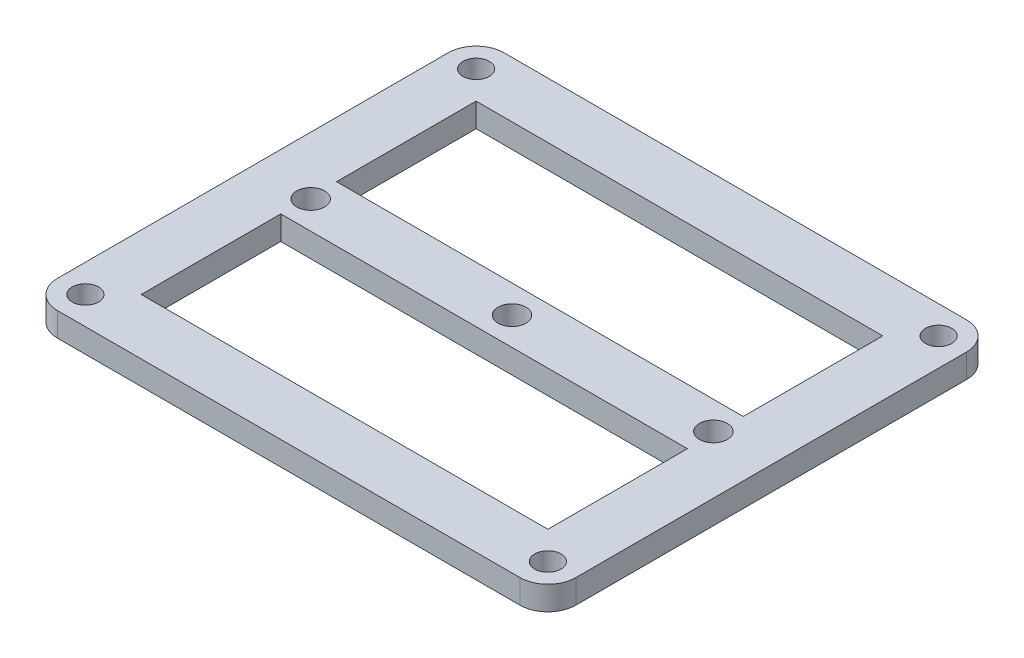
ISO-10303-21;
HEADER;
FILE_DESCRIPTION(('STEP AP214'),'2;1');
FILE_NAME('part.step','',(''),(''),'','','');
FILE_SCHEMA(('AUTOMOTIVE_DESIGN { 1 0 10303 214 1 1 1 1 }'));
ENDSEC;
DATA;
#1=APPLICATION_CONTEXT('core data for automotive mechanical design processes');
#2=APPLICATION_PROTOCOL_DEFINITION('international standard','automotive_design',2000,#1);
#3=PRODUCT_CONTEXT('',#1,'mechanical');
#4=PRODUCT('Part','Part','',(#3));
#5=PRODUCT_RELATED_PRODUCT_CATEGORY('part','',(#4));
#6=PRODUCT_DEFINITION_FORMATION('','',#4);
#7=PRODUCT_DEFINITION_CONTEXT('part definition',#1,'design');
#8=PRODUCT_DEFINITION('design','',#6,#7);
#9=PRODUCT_DEFINITION_SHAPE('','',#8);
#10=(LENGTH_UNIT() NAMED_UNIT(*) SI_UNIT(.MILLI.,.METRE.));
#11=(NAMED_UNIT(*) PLANE_ANGLE_UNIT() SI_UNIT($,.RADIAN.));
#12=(NAMED_UNIT(*) SI_UNIT($,.STERADIAN.) SOLID_ANGLE_UNIT());
#13=UNCERTAINTY_MEASURE_WITH_UNIT(LENGTH_MEASURE(1.E-05),#10,'distance_accuracy_value','');
#14=(GEOMETRIC_REPRESENTATION_CONTEXT(3) GLOBAL_UNCERTAINTY_ASSIGNED_CONTEXT((#13)) GLOBAL_UNIT_ASSIGNED_CONTEXT((#10,
#11,#12)) REPRESENTATION_CONTEXT('',''));
#15=CARTESIAN_POINT('',(0.,0.,0.));
#16=DIRECTION('',(0.,0.,1.));
#17=DIRECTION('',(1.,0.,0.));
#18=AXIS2_PLACEMENT_3D('',#15,#16,#17);
#19=CARTESIAN_POINT('',(3.50000000000018,3.,0.));
#20=DIRECTION('',(-1.,0.,0.));
#21=DIRECTION('',(0.,0.,1.));
#22=AXIS2_PLACEMENT_3D('',#19,#20,#21);
#23=PLANE('',#22);
#24=DIRECTION('',(0.,0.,-1.));
#25=VECTOR('',#24,1.);
#26=CARTESIAN_POINT('',(3.50000000000018,0.,0.));
#27=LINE('',#26,#25);
#28=CARTESIAN_POINT('',(3.50000000000018,0.,-3.50000000000023));
#29=VERTEX_POINT('',#28);
#30=CARTESIAN_POINT('',(3.50000000000017,0.,-21.));
#31=VERTEX_POINT('',#30);
#32=EDGE_CURVE('E233',#29,#31,#27,.T.);
#33=ORIENTED_EDGE('',*,*,#32,.T.);
#34=DIRECTION('',(0.,-1.,0.));
#35=VECTOR('',#34,1.);
#36=CARTESIAN_POINT('',(3.50000000000017,3.,-21.));
#37=LINE('',#36,#35);
#38=CARTESIAN_POINT('',(3.50000000000017,3.,-21.));
#39=VERTEX_POINT('',#38);
#40=EDGE_CURVE('E251',#39,#31,#37,.T.);
#41=ORIENTED_EDGE('',*,*,#40,.F.);
#42=DIRECTION('',(0.,0.,-1.));
#43=VECTOR('',#42,1.);
#44=CARTESIAN_POINT('',(3.50000000000018,3.,0.));
#45=LINE('',#44,#43);
#46=CARTESIAN_POINT('',(3.50000000000018,3.,-3.50000000000023));
#47=VERTEX_POINT('',#46);
#48=EDGE_CURVE('E187',#47,#39,#45,.T.);
#49=ORIENTED_EDGE('',*,*,#48,.F.);
#50=DIRECTION('',(0.,-1.,0.));
#51=VECTOR('',#50,1.);
#52=CARTESIAN_POINT('',(3.50000000000018,3.,-3.50000000000023));
#53=LINE('',#52,#51);
#54=EDGE_CURVE('E157',#47,#29,#53,.T.);
#55=ORIENTED_EDGE('',*,*,#54,.T.);
#56=EDGE_LOOP('',(#33,#41,#49,#55));
#57=FACE_BOUND('',#56,.T.);
#58=ADVANCED_FACE('F33',(#57),#23,.F.);
#59=CARTESIAN_POINT('',(0.,3.,-21.));
#60=DIRECTION('',(0.,0.,-1.));
#61=DIRECTION('',(-1.,0.,0.));
#62=AXIS2_PLACEMENT_3D('',#59,#60,#61);
#63=PLANE('',#62);
#64=DIRECTION('',(1.,0.,0.));
#65=VECTOR('',#64,1.);
#66=CARTESIAN_POINT('',(0.,0.,-21.));
#67=LINE('',#66,#65);
#68=CARTESIAN_POINT('',(54.4999999999999,0.,-21.));
#69=VERTEX_POINT('',#68);
#70=EDGE_CURVE('E236',#31,#69,#67,.T.);
#71=ORIENTED_EDGE('',*,*,#70,.T.);
#72=DIRECTION('',(0.,-1.,0.));
#73=VECTOR('',#72,1.);
#74=CARTESIAN_POINT('',(54.4999999999999,3.,-21.));
#75=LINE('',#74,#73);
#76=CARTESIAN_POINT('',(54.4999999999999,3.,-21.));
#77=VERTEX_POINT('',#76);
#78=EDGE_CURVE('E249',#77,#69,#75,.T.);
#79=ORIENTED_EDGE('',*,*,#78,.F.);
#80=DIRECTION('',(1.,0.,0.));
#81=VECTOR('',#80,1.);
#82=CARTESIAN_POINT('',(0.,3.,-21.));
#83=LINE('',#82,#81);
#84=EDGE_CURVE('E190',#39,#77,#83,.T.);
#85=ORIENTED_EDGE('',*,*,#84,.F.);
#86=ORIENTED_EDGE('',*,*,#40,.T.);
#87=EDGE_LOOP('',(#71,#79,#85,#86));
#88=FACE_BOUND('',#87,.T.);
#89=ADVANCED_FACE('F330',(#88),#63,.F.);
#90=CARTESIAN_POINT('',(54.4999999999998,3.,0.));
#91=DIRECTION('',(-1.,0.,0.));
#92=DIRECTION('',(0.,0.,1.));
#93=AXIS2_PLACEMENT_3D('',#90,#91,#92);
#94=PLANE('',#93);
#95=DIRECTION('',(0.,0.,-1.));
#96=VECTOR('',#95,1.);
#97=CARTESIAN_POINT('',(54.4999999999998,0.,0.));
#98=LINE('',#97,#96);
#99=CARTESIAN_POINT('',(54.4999999999998,0.,-3.50000000000003));
#100=VERTEX_POINT('',#99);
#101=EDGE_CURVE('E239',#100,#69,#98,.T.);
#102=ORIENTED_EDGE('',*,*,#101,.F.);
#103=DIRECTION('',(0.,-1.,0.));
#104=VECTOR('',#103,1.);
#105=CARTESIAN_POINT('',(54.4999999999998,3.,-3.50000000000003));
#106=LINE('',#105,#104);
#107=CARTESIAN_POINT('',(54.4999999999998,3.,-3.50000000000003));
#108=VERTEX_POINT('',#107);
#109=EDGE_CURVE('E247',#108,#100,#106,.T.);
#110=ORIENTED_EDGE('',*,*,#109,.F.);
#111=DIRECTION('',(0.,0.,-1.));
#112=VECTOR('',#111,1.);
#113=CARTESIAN_POINT('',(54.4999999999998,3.,0.));
#114=LINE('',#113,#112);
#115=EDGE_CURVE('E192',#108,#77,#114,.T.);
#116=ORIENTED_EDGE('',*,*,#115,.T.);
#117=ORIENTED_EDGE('',*,*,#78,.T.);
#118=EDGE_LOOP('',(#102,#110,#116,#117));
#119=FACE_BOUND('',#118,.T.);
#120=ADVANCED_FACE('F336',(#119),#94,.T.);
#121=CARTESIAN_POINT('',(-3.5,3.,0.));
#122=DIRECTION('',(-1.,0.,0.));
#123=DIRECTION('',(0.,0.,1.));
#124=AXIS2_PLACEMENT_3D('',#121,#122,#123);
#125=PLANE('',#124);
#126=DIRECTION('',(0.,0.,-1.));
#127=VECTOR('',#126,1.);
#128=CARTESIAN_POINT('',(-3.5,0.,0.));
#129=LINE('',#128,#127);
#130=CARTESIAN_POINT('',(-3.5,0.,0.));
#131=VERTEX_POINT('',#130);
#132=CARTESIAN_POINT('',(-3.5,0.,-49.));
#133=VERTEX_POINT('',#132);
#134=EDGE_CURVE('E221',#131,#133,#129,.T.);
#135=ORIENTED_EDGE('',*,*,#134,.F.);
#136=DIRECTION('',(0.,-1.,0.));
#137=VECTOR('',#136,1.);
#138=CARTESIAN_POINT('',(-3.5,3.,0.));
#139=LINE('',#138,#137);
#140=CARTESIAN_POINT('',(-3.5,3.,0.));
#141=VERTEX_POINT('',#140);
#142=EDGE_CURVE('E275',#131,#141,#139,.F.);
#143=ORIENTED_EDGE('',*,*,#142,.T.);
#144=DIRECTION('',(0.,0.,-1.));
#145=VECTOR('',#144,1.);
#146=CARTESIAN_POINT('',(-3.5,3.,0.));
#147=LINE('',#146,#145);
#148=CARTESIAN_POINT('',(-3.5,3.,-49.));
#149=VERTEX_POINT('',#148);
#150=EDGE_CURVE('E177',#141,#149,#147,.T.);
#151=ORIENTED_EDGE('',*,*,#150,.T.);
#152=DIRECTION('',(0.,-1.,0.));
#153=VECTOR('',#152,1.);
#154=CARTESIAN_POINT('',(-3.5,3.,-49.));
#155=LINE('',#154,#153);
#156=EDGE_CURVE('E272',#149,#133,#155,.T.);
#157=ORIENTED_EDGE('',*,*,#156,.T.);
#158=EDGE_LOOP('',(#135,#143,#151,#157));
#159=FACE_BOUND('',#158,.T.);
#160=ADVANCED_FACE('F311',(#159),#125,.T.);
#161=CARTESIAN_POINT('',(0.,3.,3.50000000000005));
#162=DIRECTION('',(0.,0.,-1.));
#163=DIRECTION('',(-1.,0.,0.));
#164=AXIS2_PLACEMENT_3D('',#161,#162,#163);
#165=PLANE('',#164);
#166=DIRECTION('',(1.,0.,0.));
#167=VECTOR('',#166,1.);
#168=CARTESIAN_POINT('',(0.,3.,3.50000000000005));
#169=LINE('',#168,#167);
#170=CARTESIAN_POINT('',(0.,3.,3.50000000000005));
#171=VERTEX_POINT('',#170);
#172=CARTESIAN_POINT('',(58.,3.,3.49999999999986));
#173=VERTEX_POINT('',#172);
#174=EDGE_CURVE('E180',#171,#173,#169,.T.);
#175=ORIENTED_EDGE('',*,*,#174,.F.);
#176=DIRECTION('',(0.,-1.,0.));
#177=VECTOR('',#176,1.);
#178=CARTESIAN_POINT('',(0.,0.,3.50000000000005));
#179=LINE('',#178,#177);
#180=CARTESIAN_POINT('',(0.,0.,3.50000000000005));
#181=VERTEX_POINT('',#180);
#182=EDGE_CURVE('E261',#171,#181,#179,.T.);
#183=ORIENTED_EDGE('',*,*,#182,.T.);
#184=DIRECTION('',(1.,0.,0.));
#185=VECTOR('',#184,1.);
#186=CARTESIAN_POINT('',(0.,0.,3.50000000000005));
#187=LINE('',#186,#185);
#188=CARTESIAN_POINT('',(58.,0.,3.49999999999986));
#189=VERTEX_POINT('',#188);
#190=EDGE_CURVE('E224',#181,#189,#187,.T.);
#191=ORIENTED_EDGE('',*,*,#190,.T.);
#192=DIRECTION('',(0.,-1.,0.));
#193=VECTOR('',#192,1.);
#194=CARTESIAN_POINT('',(58.,3.,3.49999999999986));
#195=LINE('',#194,#193);
#196=EDGE_CURVE('E254',#189,#173,#195,.F.);
#197=ORIENTED_EDGE('',*,*,#196,.T.);
#198=EDGE_LOOP('',(#175,#183,#191,#197));
#199=FACE_BOUND('',#198,.T.);
#200=ADVANCED_FACE('F319',(#199),#165,.F.);
#201=CARTESIAN_POINT('',(61.5,3.,1.90509810308168E-13));
#202=DIRECTION('',(-1.,0.,0.));
#203=DIRECTION('',(0.,0.,1.));
#204=AXIS2_PLACEMENT_3D('',#201,#202,#203);
#205=PLANE('',#204);
#206=DIRECTION('',(0.,0.,-1.));
#207=VECTOR('',#206,1.);
#208=CARTESIAN_POINT('',(61.5,3.,1.90509810308168E-13));
#209=LINE('',#208,#207);
#210=CARTESIAN_POINT('',(61.5,3.,1.90509810308168E-13));
#211=VERTEX_POINT('',#210);
#212=CARTESIAN_POINT('',(61.5000000000002,3.,-49.));
#213=VERTEX_POINT('',#212);
#214=EDGE_CURVE('E183',#211,#213,#209,.T.);
#215=ORIENTED_EDGE('',*,*,#214,.F.);
#216=DIRECTION('',(0.,-1.,0.));
#217=VECTOR('',#216,1.);
#218=CARTESIAN_POINT('',(61.5,3.,1.90509810308168E-13));
#219=LINE('',#218,#217);
#220=CARTESIAN_POINT('',(61.5,0.,1.90509810308168E-13));
#221=VERTEX_POINT('',#220);
#222=EDGE_CURVE('E286',#211,#221,#219,.T.);
#223=ORIENTED_EDGE('',*,*,#222,.T.);
#224=DIRECTION('',(0.,0.,-1.));
#225=VECTOR('',#224,1.);
#226=CARTESIAN_POINT('',(61.5,0.,1.90509810308168E-13));
#227=LINE('',#226,#225);
#228=CARTESIAN_POINT('',(61.5000000000002,0.,-49.));
#229=VERTEX_POINT('',#228);
#230=EDGE_CURVE('E227',#221,#229,#227,.T.);
#231=ORIENTED_EDGE('',*,*,#230,.T.);
#232=DIRECTION('',(0.,-1.,0.));
#233=VECTOR('',#232,1.);
#234=CARTESIAN_POINT('',(61.5000000000002,3.,-49.));
#235=LINE('',#234,#233);
#236=EDGE_CURVE('E284',#229,#213,#235,.F.);
#237=ORIENTED_EDGE('',*,*,#236,.T.);
#238=EDGE_LOOP('',(#215,#223,#231,#237));
#239=FACE_BOUND('',#238,.T.);
#240=ADVANCED_FACE('F292',(#239),#205,.F.);
#241=CARTESIAN_POINT('',(54.4999999999999,3.,0.));
#242=DIRECTION('',(-1.,0.,0.));
#243=DIRECTION('',(0.,0.,1.));
#244=AXIS2_PLACEMENT_3D('',#241,#242,#243);
#245=PLANE('',#244);
#246=DIRECTION('',(0.,0.,-1.));
#247=VECTOR('',#246,1.);
#248=CARTESIAN_POINT('',(54.4999999999999,0.,0.));
#249=LINE('',#248,#247);
#250=CARTESIAN_POINT('',(54.4999999999999,0.,-28.));
#251=VERTEX_POINT('',#250);
#252=CARTESIAN_POINT('',(54.4999999999999,0.,-45.5));
#253=VERTEX_POINT('',#252);
#254=EDGE_CURVE('E152',#251,#253,#249,.T.);
#255=ORIENTED_EDGE('',*,*,#254,.F.);
#256=DIRECTION('',(0.,-1.,0.));
#257=VECTOR('',#256,1.);
#258=CARTESIAN_POINT('',(54.4999999999999,3.,-28.));
#259=LINE('',#258,#257);
#260=CARTESIAN_POINT('',(54.4999999999999,3.,-28.));
#261=VERTEX_POINT('',#260);
#262=EDGE_CURVE('E147',#261,#251,#259,.T.);
#263=ORIENTED_EDGE('',*,*,#262,.F.);
#264=DIRECTION('',(0.,0.,-1.));
#265=VECTOR('',#264,1.);
#266=CARTESIAN_POINT('',(54.4999999999999,3.,0.));
#267=LINE('',#266,#265);
#268=CARTESIAN_POINT('',(54.4999999999999,3.,-45.5));
#269=VERTEX_POINT('',#268);
#270=EDGE_CURVE('E150',#261,#269,#267,.T.);
#271=ORIENTED_EDGE('',*,*,#270,.T.);
#272=DIRECTION('',(0.,-1.,0.));
#273=VECTOR('',#272,1.);
#274=CARTESIAN_POINT('',(54.4999999999999,3.,-45.5));
#275=LINE('',#274,#273);
#276=EDGE_CURVE('E198',#269,#253,#275,.T.);
#277=ORIENTED_EDGE('',*,*,#276,.T.);
#278=EDGE_LOOP('',(#255,#263,#271,#277));
#279=FACE_BOUND('',#278,.T.);
#280=ADVANCED_FACE('F149',(#279),#245,.T.);
#281=CARTESIAN_POINT('',(0.,3.,-28.));
#282=DIRECTION('',(0.,0.,-1.));
#283=DIRECTION('',(-1.,0.,0.));
#284=AXIS2_PLACEMENT_3D('',#281,#282,#283);
#285=PLANE('',#284);
#286=DIRECTION('',(1.,0.,0.));
#287=VECTOR('',#286,1.);
#288=CARTESIAN_POINT('',(0.,0.,-28.));
#289=LINE('',#288,#287);
#290=CARTESIAN_POINT('',(3.50000000000017,0.,-28.));
#291=VERTEX_POINT('',#290);
#292=EDGE_CURVE('E213',#291,#251,#289,.T.);
#293=ORIENTED_EDGE('',*,*,#292,.F.);
#294=DIRECTION('',(0.,-1.,0.));
#295=VECTOR('',#294,1.);
#296=CARTESIAN_POINT('',(3.50000000000017,3.,-28.));
#297=LINE('',#296,#295);
#298=CARTESIAN_POINT('',(3.50000000000017,3.,-28.));
#299=VERTEX_POINT('',#298);
#300=EDGE_CURVE('E158',#299,#291,#297,.T.);
#301=ORIENTED_EDGE('',*,*,#300,.F.);
#302=DIRECTION('',(1.,0.,0.));
#303=VECTOR('',#302,1.);
#304=CARTESIAN_POINT('',(0.,3.,-28.));
#305=LINE('',#304,#303);
#306=EDGE_CURVE('E164',#299,#261,#305,.T.);
#307=ORIENTED_EDGE('',*,*,#306,.T.);
#308=ORIENTED_EDGE('',*,*,#262,.T.);
#309=EDGE_LOOP('',(#293,#301,#307,#308));
#310=FACE_BOUND('',#309,.T.);
#311=ADVANCED_FACE('F169',(#310),#285,.T.);
#312=CARTESIAN_POINT('',(3.50000000000018,3.,0.));
#313=DIRECTION('',(-1.,0.,0.));
#314=DIRECTION('',(0.,0.,1.));
#315=AXIS2_PLACEMENT_3D('',#312,#313,#314);
#316=PLANE('',#315);
#317=DIRECTION('',(0.,0.,-1.));
#318=VECTOR('',#317,1.);
#319=CARTESIAN_POINT('',(3.50000000000018,0.,0.));
#320=LINE('',#319,#318);
#321=CARTESIAN_POINT('',(3.50000000000017,0.,-45.4999999999998));
#322=VERTEX_POINT('',#321);
#323=EDGE_CURVE('E215',#291,#322,#320,.T.);
#324=ORIENTED_EDGE('',*,*,#323,.T.);
#325=DIRECTION('',(0.,-1.,0.));
#326=VECTOR('',#325,1.);
#327=CARTESIAN_POINT('',(3.50000000000017,3.,-45.4999999999998));
#328=LINE('',#327,#326);
#329=CARTESIAN_POINT('',(3.50000000000017,3.,-45.4999999999998));
#330=VERTEX_POINT('',#329);
#331=EDGE_CURVE('E256',#330,#322,#328,.T.);
#332=ORIENTED_EDGE('',*,*,#331,.F.);
#333=DIRECTION('',(0.,0.,-1.));
#334=VECTOR('',#333,1.);
#335=CARTESIAN_POINT('',(3.50000000000018,3.,0.));
#336=LINE('',#335,#334);
#337=EDGE_CURVE('E171',#299,#330,#336,.T.);
#338=ORIENTED_EDGE('',*,*,#337,.F.);
#339=ORIENTED_EDGE('',*,*,#300,.T.);
#340=EDGE_LOOP('',(#324,#332,#338,#339));
#341=FACE_BOUND('',#340,.T.);
#342=ADVANCED_FACE('F344',(#341),#316,.F.);
#343=CARTESIAN_POINT('',(0.,3.,-52.5));
#344=DIRECTION('',(0.,0.,-1.));
#345=DIRECTION('',(-1.,0.,0.));
#346=AXIS2_PLACEMENT_3D('',#343,#344,#345);
#347=PLANE('',#346);
#348=DIRECTION('',(1.,0.,0.));
#349=VECTOR('',#348,1.);
#350=CARTESIAN_POINT('',(0.,3.,-52.5));
#351=LINE('',#350,#349);
#352=CARTESIAN_POINT('',(0.,3.,-52.5));
#353=VERTEX_POINT('',#352);
#354=CARTESIAN_POINT('',(58.0000000000002,3.,-52.5));
#355=VERTEX_POINT('',#354);
#356=EDGE_CURVE('E185',#353,#355,#351,.T.);
#357=ORIENTED_EDGE('',*,*,#356,.T.);
#358=DIRECTION('',(0.,-1.,0.));
#359=VECTOR('',#358,1.);
#360=CARTESIAN_POINT('',(58.0000000000002,0.,-52.5));
#361=LINE('',#360,#359);
#362=CARTESIAN_POINT('',(58.0000000000002,0.,-52.5));
#363=VERTEX_POINT('',#362);
#364=EDGE_CURVE('E11',#355,#363,#361,.T.);
#365=ORIENTED_EDGE('',*,*,#364,.T.);
#366=DIRECTION('',(1.,0.,0.));
#367=VECTOR('',#366,1.);
#368=CARTESIAN_POINT('',(0.,0.,-52.5));
#369=LINE('',#368,#367);
#370=CARTESIAN_POINT('',(0.,0.,-52.5));
#371=VERTEX_POINT('',#370);
#372=EDGE_CURVE('E230',#371,#363,#369,.T.);
#373=ORIENTED_EDGE('',*,*,#372,.F.);
#374=DIRECTION('',(0.,-1.,0.));
#375=VECTOR('',#374,1.);
#376=CARTESIAN_POINT('',(0.,3.,-52.5));
#377=LINE('',#376,#375);
#378=EDGE_CURVE('E41',#371,#353,#377,.F.);
#379=ORIENTED_EDGE('',*,*,#378,.T.);
#380=EDGE_LOOP('',(#357,#365,#373,#379));
#381=FACE_BOUND('',#380,.T.);
#382=ADVANCED_FACE('F303',(#381),#347,.T.);
#383=CARTESIAN_POINT('',(-1.79526872670698E-13,3.,-45.4999999999998));
#384=DIRECTION('',(0.,0.,-1.));
#385=DIRECTION('',(-1.,0.,0.));
#386=AXIS2_PLACEMENT_3D('',#383,#384,#385);
#387=PLANE('',#386);
#388=DIRECTION('',(1.,0.,0.));
#389=VECTOR('',#388,1.);
#390=CARTESIAN_POINT('',(-1.79526872670698E-13,0.,-45.4999999999998));
#391=LINE('',#390,#389);
#392=EDGE_CURVE('E218',#322,#253,#391,.T.);
#393=ORIENTED_EDGE('',*,*,#392,.T.);
#394=ORIENTED_EDGE('',*,*,#276,.F.);
#395=DIRECTION('',(1.,0.,0.));
#396=VECTOR('',#395,1.);
#397=CARTESIAN_POINT('',(-1.79526872670698E-13,3.,-45.4999999999998));
#398=LINE('',#397,#396);
#399=EDGE_CURVE('E165',#330,#269,#398,.T.);
#400=ORIENTED_EDGE('',*,*,#399,.F.);
#401=ORIENTED_EDGE('',*,*,#331,.T.);
#402=EDGE_LOOP('',(#393,#394,#400,#401));
#403=FACE_BOUND('',#402,.T.);
#404=ADVANCED_FACE('F343',(#403),#387,.F.);
#405=CARTESIAN_POINT('',(0.,3.,0.));
#406=DIRECTION('',(0.,-1.,0.));
#407=DIRECTION('',(0.,0.,-1.));
#408=AXIS2_PLACEMENT_3D('',#405,#406,#407);
#409=CYLINDRICAL_SURFACE('',#408,1.65);
#410=CARTESIAN_POINT('',(0.,3.,0.));
#411=DIRECTION('',(0.,1.,0.));
#412=DIRECTION('',(0.,0.,1.));
#413=AXIS2_PLACEMENT_3D('',#410,#411,#412);
#414=CIRCLE('',#413,1.65);
#415=CARTESIAN_POINT('',(0.,3.,1.65));
#416=VERTEX_POINT('',#415);
#417=EDGE_CURVE('E167',#416,#416,#414,.T.);
#418=ORIENTED_EDGE('',*,*,#417,.T.);
#419=EDGE_LOOP('',(#418));
#420=FACE_BOUND('',#419,.T.);
#421=CARTESIAN_POINT('',(0.,0.,0.));
#422=DIRECTION('',(0.,1.,0.));
#423=DIRECTION('',(0.,0.,1.));
#424=AXIS2_PLACEMENT_3D('',#421,#422,#423);
#425=CIRCLE('',#424,1.65);
#426=CARTESIAN_POINT('',(0.,0.,1.65));
#427=VERTEX_POINT('',#426);
#428=EDGE_CURVE('E209',#427,#427,#425,.T.);
#429=ORIENTED_EDGE('',*,*,#428,.F.);
#430=EDGE_LOOP('',(#429));
#431=FACE_BOUND('',#430,.T.);
#432=ADVANCED_FACE('F353',(#420,#431),#409,.F.);
#433=CARTESIAN_POINT('',(58.,3.,0.));
#434=DIRECTION('',(0.,-1.,0.));
#435=DIRECTION('',(0.,0.,-1.));
#436=AXIS2_PLACEMENT_3D('',#433,#434,#435);
#437=CYLINDRICAL_SURFACE('',#436,1.65);
#438=CARTESIAN_POINT('',(58.,3.,0.));
#439=DIRECTION('',(0.,1.,0.));
#440=DIRECTION('',(0.,0.,1.));
#441=AXIS2_PLACEMENT_3D('',#438,#439,#440);
#442=CIRCLE('',#441,1.65);
#443=CARTESIAN_POINT('',(58.,3.,1.65));
#444=VERTEX_POINT('',#443);
#445=EDGE_CURVE('E553',#444,#444,#442,.T.);
#446=ORIENTED_EDGE('',*,*,#445,.T.);
#447=EDGE_LOOP('',(#446));
#448=FACE_BOUND('',#447,.T.);
#449=CARTESIAN_POINT('',(58.,0.,0.));
#450=DIRECTION('',(0.,1.,0.));
#451=DIRECTION('',(0.,0.,1.));
#452=AXIS2_PLACEMENT_3D('',#449,#450,#451);
#453=CIRCLE('',#452,1.65);
#454=CARTESIAN_POINT('',(58.,0.,1.65));
#455=VERTEX_POINT('',#454);
#456=EDGE_CURVE('E206',#455,#455,#453,.T.);
#457=ORIENTED_EDGE('',*,*,#456,.F.);
#458=EDGE_LOOP('',(#457));
#459=FACE_BOUND('',#458,.T.);
#460=ADVANCED_FACE('F364',(#448,#459),#437,.F.);
#461=CARTESIAN_POINT('',(57.9999999999998,3.,-49.));
#462=DIRECTION('',(0.,-1.,0.));
#463=DIRECTION('',(0.,0.,-1.));
#464=AXIS2_PLACEMENT_3D('',#461,#462,#463);
#465=CYLINDRICAL_SURFACE('',#464,1.65);
#466=CARTESIAN_POINT('',(57.9999999999998,3.,-49.));
#467=DIRECTION('',(0.,1.,0.));
#468=DIRECTION('',(0.,0.,1.));
#469=AXIS2_PLACEMENT_3D('',#466,#467,#468);
#470=CIRCLE('',#469,1.65);
#471=CARTESIAN_POINT('',(57.9999999999998,3.,-47.35));
#472=VERTEX_POINT('',#471);
#473=EDGE_CURVE('E550',#472,#472,#470,.T.);
#474=ORIENTED_EDGE('',*,*,#473,.T.);
#475=EDGE_LOOP('',(#474));
#476=FACE_BOUND('',#475,.T.);
#477=CARTESIAN_POINT('',(57.9999999999998,0.,-49.));
#478=DIRECTION('',(0.,1.,0.));
#479=DIRECTION('',(0.,0.,1.));
#480=AXIS2_PLACEMENT_3D('',#477,#478,#479);
#481=CIRCLE('',#480,1.65);
#482=CARTESIAN_POINT('',(57.9999999999998,0.,-47.35));
#483=VERTEX_POINT('',#482);
#484=EDGE_CURVE('E202',#483,#483,#481,.T.);
#485=ORIENTED_EDGE('',*,*,#484,.F.);
#486=EDGE_LOOP('',(#485));
#487=FACE_BOUND('',#486,.T.);
#488=ADVANCED_FACE('F368',(#476,#487),#465,.F.);
#489=CARTESIAN_POINT('',(-1.68082200945403E-13,3.,-49.));
#490=DIRECTION('',(0.,-1.,0.));
#491=DIRECTION('',(0.,0.,-1.));
#492=AXIS2_PLACEMENT_3D('',#489,#490,#491);
#493=CYLINDRICAL_SURFACE('',#492,1.65);
#494=CARTESIAN_POINT('',(-1.68082200945403E-13,3.,-49.));
#495=DIRECTION('',(0.,1.,0.));
#496=DIRECTION('',(0.,0.,1.));
#497=AXIS2_PLACEMENT_3D('',#494,#495,#496);
#498=CIRCLE('',#497,1.65);
#499=CARTESIAN_POINT('',(-1.68082200945403E-13,3.,-47.35));
#500=VERTEX_POINT('',#499);
#501=EDGE_CURVE('E245',#500,#500,#498,.T.);
#502=ORIENTED_EDGE('',*,*,#501,.T.);
#503=EDGE_LOOP('',(#502));
#504=FACE_BOUND('',#503,.T.);
#505=CARTESIAN_POINT('',(-1.68082200945403E-13,0.,-49.));
#506=DIRECTION('',(0.,1.,0.));
#507=DIRECTION('',(0.,0.,1.));
#508=AXIS2_PLACEMENT_3D('',#505,#506,#507);
#509=CIRCLE('',#508,1.65);
#510=CARTESIAN_POINT('',(-1.68082200945403E-13,0.,-47.35));
#511=VERTEX_POINT('',#510);
#512=EDGE_CURVE('E199',#511,#511,#509,.T.);
#513=ORIENTED_EDGE('',*,*,#512,.F.);
#514=EDGE_LOOP('',(#513));
#515=FACE_BOUND('',#514,.T.);
#516=ADVANCED_FACE('F372',(#504,#515),#493,.F.);
#517=CARTESIAN_POINT('',(0.,3.,-3.50000000000025));
#518=DIRECTION('',(0.,0.,-1.));
#519=DIRECTION('',(-1.,0.,0.));
#520=AXIS2_PLACEMENT_3D('',#517,#518,#519);
#521=PLANE('',#520);
#522=DIRECTION('',(1.,0.,0.));
#523=VECTOR('',#522,1.);
#524=CARTESIAN_POINT('',(0.,0.,-3.50000000000025));
#525=LINE('',#524,#523);
#526=EDGE_CURVE('E242',#29,#100,#525,.T.);
#527=ORIENTED_EDGE('',*,*,#526,.F.);
#528=ORIENTED_EDGE('',*,*,#54,.F.);
#529=DIRECTION('',(1.,0.,0.));
#530=VECTOR('',#529,1.);
#531=CARTESIAN_POINT('',(0.,3.,-3.50000000000025));
#532=LINE('',#531,#530);
#533=EDGE_CURVE('E195',#47,#108,#532,.T.);
#534=ORIENTED_EDGE('',*,*,#533,.T.);
#535=ORIENTED_EDGE('',*,*,#109,.T.);
#536=EDGE_LOOP('',(#527,#528,#534,#535));
#537=FACE_BOUND('',#536,.T.);
#538=ADVANCED_FACE('F375',(#537),#521,.T.);
#539=CARTESIAN_POINT('',(0.,3.,0.));
#540=DIRECTION('',(0.,1.,0.));
#541=DIRECTION('',(0.,0.,1.));
#542=AXIS2_PLACEMENT_3D('',#539,#540,#541);
#543=PLANE('',#542);
#544=CARTESIAN_POINT('',(3.75000000000002,3.,-24.4999999999999));
#545=DIRECTION('',(0.,1.,0.));
#546=DIRECTION('',(0.,0.,1.));
#547=AXIS2_PLACEMENT_3D('',#544,#545,#546);
#548=CIRCLE('',#547,1.75);
#549=CARTESIAN_POINT('',(3.75000000000002,3.,-22.7499999999999));
#550=VERTEX_POINT('',#549);
#551=EDGE_CURVE('E532',#550,#550,#548,.T.);
#552=ORIENTED_EDGE('',*,*,#551,.F.);
#553=EDGE_LOOP('',(#552));
#554=FACE_BOUND('',#553,.T.);
#555=CARTESIAN_POINT('',(29.,3.,-24.4999999999999));
#556=DIRECTION('',(0.,1.,0.));
#557=DIRECTION('',(0.,0.,1.));
#558=AXIS2_PLACEMENT_3D('',#555,#556,#557);
#559=CIRCLE('',#558,1.75);
#560=CARTESIAN_POINT('',(29.,3.,-22.7499999999999));
#561=VERTEX_POINT('',#560);
#562=EDGE_CURVE('E538',#561,#561,#559,.T.);
#563=ORIENTED_EDGE('',*,*,#562,.F.);
#564=EDGE_LOOP('',(#563));
#565=FACE_BOUND('',#564,.T.);
#566=CARTESIAN_POINT('',(54.25,3.,-24.4999999999999));
#567=DIRECTION('',(0.,1.,0.));
#568=DIRECTION('',(0.,0.,1.));
#569=AXIS2_PLACEMENT_3D('',#566,#567,#568);
#570=CIRCLE('',#569,1.75);
#571=CARTESIAN_POINT('',(54.25,3.,-22.7499999999999));
#572=VERTEX_POINT('',#571);
#573=EDGE_CURVE('E544',#572,#572,#570,.T.);
#574=ORIENTED_EDGE('',*,*,#573,.F.);
#575=EDGE_LOOP('',(#574));
#576=FACE_BOUND('',#575,.T.);
#577=ORIENTED_EDGE('',*,*,#501,.F.);
#578=EDGE_LOOP('',(#577));
#579=FACE_BOUND('',#578,.T.);
#580=ORIENTED_EDGE('',*,*,#473,.F.);
#581=EDGE_LOOP('',(#580));
#582=FACE_BOUND('',#581,.T.);
#583=ORIENTED_EDGE('',*,*,#445,.F.);
#584=EDGE_LOOP('',(#583));
#585=FACE_BOUND('',#584,.T.);
#586=ORIENTED_EDGE('',*,*,#417,.F.);
#587=EDGE_LOOP('',(#586));
#588=FACE_BOUND('',#587,.T.);
#589=ORIENTED_EDGE('',*,*,#270,.F.);
#590=ORIENTED_EDGE('',*,*,#306,.F.);
#591=ORIENTED_EDGE('',*,*,#337,.T.);
#592=ORIENTED_EDGE('',*,*,#399,.T.);
#593=EDGE_LOOP('',(#589,#590,#591,#592));
#594=FACE_BOUND('',#593,.T.);
#595=ORIENTED_EDGE('',*,*,#150,.F.);
#596=CARTESIAN_POINT('',(0.,3.,0.));
#597=DIRECTION('',(0.,1.,0.));
#598=DIRECTION('',(0.,0.,1.));
#599=AXIS2_PLACEMENT_3D('',#596,#597,#598);
#600=CIRCLE('',#599,3.5);
#601=EDGE_CURVE('E282',#141,#171,#600,.T.);
#602=ORIENTED_EDGE('',*,*,#601,.T.);
#603=ORIENTED_EDGE('',*,*,#174,.T.);
#604=CARTESIAN_POINT('',(58.,3.,1.79667788583313E-13));
#605=DIRECTION('',(0.,1.,0.));
#606=DIRECTION('',(0.,0.,1.));
#607=AXIS2_PLACEMENT_3D('',#604,#605,#606);
#608=CIRCLE('',#607,3.5);
#609=EDGE_CURVE('E280',#173,#211,#608,.T.);
#610=ORIENTED_EDGE('',*,*,#609,.T.);
#611=ORIENTED_EDGE('',*,*,#214,.T.);
#612=CARTESIAN_POINT('',(58.0000000000002,3.,-49.));
#613=DIRECTION('',(0.,1.,0.));
#614=DIRECTION('',(0.,0.,1.));
#615=AXIS2_PLACEMENT_3D('',#612,#613,#614);
#616=CIRCLE('',#615,3.5);
#617=EDGE_CURVE('E48',#213,#355,#616,.T.);
#618=ORIENTED_EDGE('',*,*,#617,.T.);
#619=ORIENTED_EDGE('',*,*,#356,.F.);
#620=CARTESIAN_POINT('',(0.,3.,-49.));
#621=DIRECTION('',(0.,1.,0.));
#622=DIRECTION('',(0.,0.,1.));
#623=AXIS2_PLACEMENT_3D('',#620,#621,#622);
#624=CIRCLE('',#623,3.5);
#625=EDGE_CURVE('E277',#353,#149,#624,.T.);
#626=ORIENTED_EDGE('',*,*,#625,.T.);
#627=EDGE_LOOP('',(#595,#602,#603,#610,#611,#618,#619,#626));
#628=FACE_BOUND('',#627,.T.);
#629=ORIENTED_EDGE('',*,*,#48,.T.);
#630=ORIENTED_EDGE('',*,*,#84,.T.);
#631=ORIENTED_EDGE('',*,*,#115,.F.);
#632=ORIENTED_EDGE('',*,*,#533,.F.);
#633=EDGE_LOOP('',(#629,#630,#631,#632));
#634=FACE_BOUND('',#633,.T.);
#635=ADVANCED_FACE('F162',(#554,#565,#576,#579,#582,#585,#588,#594,#628,#634),#543,.T.);
#636=CARTESIAN_POINT('',(0.,0.,0.));
#637=DIRECTION('',(0.,1.,0.));
#638=DIRECTION('',(0.,0.,1.));
#639=AXIS2_PLACEMENT_3D('',#636,#637,#638);
#640=PLANE('',#639);
#641=CARTESIAN_POINT('',(3.75000000000002,0.,-24.4999999999999));
#642=DIRECTION('',(0.,1.,0.));
#643=DIRECTION('',(0.,0.,1.));
#644=AXIS2_PLACEMENT_3D('',#641,#642,#643);
#645=CIRCLE('',#644,1.75);
#646=CARTESIAN_POINT('',(3.75000000000002,0.,-22.7499999999999));
#647=VERTEX_POINT('',#646);
#648=EDGE_CURVE('E203',#647,#647,#645,.F.);
#649=ORIENTED_EDGE('',*,*,#648,.F.);
#650=EDGE_LOOP('',(#649));
#651=FACE_BOUND('',#650,.T.);
#652=CARTESIAN_POINT('',(29.,0.,-24.4999999999999));
#653=DIRECTION('',(0.,1.,0.));
#654=DIRECTION('',(0.,0.,1.));
#655=AXIS2_PLACEMENT_3D('',#652,#653,#654);
#656=CIRCLE('',#655,1.75);
#657=CARTESIAN_POINT('',(29.,0.,-22.7499999999999));
#658=VERTEX_POINT('',#657);
#659=EDGE_CURVE('E535',#658,#658,#656,.F.);
#660=ORIENTED_EDGE('',*,*,#659,.F.);
#661=EDGE_LOOP('',(#660));
#662=FACE_BOUND('',#661,.T.);
#663=CARTESIAN_POINT('',(54.25,0.,-24.4999999999999));
#664=DIRECTION('',(0.,1.,0.));
#665=DIRECTION('',(0.,0.,1.));
#666=AXIS2_PLACEMENT_3D('',#663,#664,#665);
#667=CIRCLE('',#666,1.75);
#668=CARTESIAN_POINT('',(54.25,0.,-22.7499999999999));
#669=VERTEX_POINT('',#668);
#670=EDGE_CURVE('E541',#669,#669,#667,.F.);
#671=ORIENTED_EDGE('',*,*,#670,.F.);
#672=EDGE_LOOP('',(#671));
#673=FACE_BOUND('',#672,.T.);
#674=ORIENTED_EDGE('',*,*,#512,.T.);
#675=EDGE_LOOP('',(#674));
#676=FACE_BOUND('',#675,.T.);
#677=ORIENTED_EDGE('',*,*,#484,.T.);
#678=EDGE_LOOP('',(#677));
#679=FACE_BOUND('',#678,.T.);
#680=ORIENTED_EDGE('',*,*,#456,.T.);
#681=EDGE_LOOP('',(#680));
#682=FACE_BOUND('',#681,.T.);
#683=ORIENTED_EDGE('',*,*,#428,.T.);
#684=EDGE_LOOP('',(#683));
#685=FACE_BOUND('',#684,.T.);
#686=ORIENTED_EDGE('',*,*,#254,.T.);
#687=ORIENTED_EDGE('',*,*,#392,.F.);
#688=ORIENTED_EDGE('',*,*,#323,.F.);
#689=ORIENTED_EDGE('',*,*,#292,.T.);
#690=EDGE_LOOP('',(#686,#687,#688,#689));
#691=FACE_BOUND('',#690,.T.);
#692=ORIENTED_EDGE('',*,*,#190,.F.);
#693=CARTESIAN_POINT('',(0.,0.,0.));
#694=DIRECTION('',(0.,1.,0.));
#695=DIRECTION('',(0.,0.,1.));
#696=AXIS2_PLACEMENT_3D('',#693,#694,#695);
#697=CIRCLE('',#696,3.5);
#698=EDGE_CURVE('E270',#181,#131,#697,.F.);
#699=ORIENTED_EDGE('',*,*,#698,.T.);
#700=ORIENTED_EDGE('',*,*,#134,.T.);
#701=CARTESIAN_POINT('',(0.,0.,-49.));
#702=DIRECTION('',(0.,1.,0.));
#703=DIRECTION('',(0.,0.,1.));
#704=AXIS2_PLACEMENT_3D('',#701,#702,#703);
#705=CIRCLE('',#704,3.5);
#706=EDGE_CURVE('E264',#133,#371,#705,.F.);
#707=ORIENTED_EDGE('',*,*,#706,.T.);
#708=ORIENTED_EDGE('',*,*,#372,.T.);
#709=CARTESIAN_POINT('',(58.0000000000002,0.,-49.));
#710=DIRECTION('',(0.,1.,0.));
#711=DIRECTION('',(0.,0.,1.));
#712=AXIS2_PLACEMENT_3D('',#709,#710,#711);
#713=CIRCLE('',#712,3.5);
#714=EDGE_CURVE('E266',#363,#229,#713,.F.);
#715=ORIENTED_EDGE('',*,*,#714,.T.);
#716=ORIENTED_EDGE('',*,*,#230,.F.);
#717=CARTESIAN_POINT('',(58.,0.,1.79667788583313E-13));
#718=DIRECTION('',(0.,1.,0.));
#719=DIRECTION('',(0.,0.,1.));
#720=AXIS2_PLACEMENT_3D('',#717,#718,#719);
#721=CIRCLE('',#720,3.5);
#722=EDGE_CURVE('E268',#221,#189,#721,.F.);
#723=ORIENTED_EDGE('',*,*,#722,.T.);
#724=EDGE_LOOP('',(#692,#699,#700,#707,#708,#715,#716,#723));
#725=FACE_BOUND('',#724,.T.);
#726=ORIENTED_EDGE('',*,*,#32,.F.);
#727=ORIENTED_EDGE('',*,*,#526,.T.);
#728=ORIENTED_EDGE('',*,*,#101,.T.);
#729=ORIENTED_EDGE('',*,*,#70,.F.);
#730=EDGE_LOOP('',(#726,#727,#728,#729));
#731=FACE_BOUND('',#730,.T.);
#732=ADVANCED_FACE('F298',(#651,#662,#673,#676,#679,#682,#685,#691,#725,#731),#640,.F.);
#733=CARTESIAN_POINT('',(0.,3.,0.));
#734=DIRECTION('',(0.,1.,0.));
#735=DIRECTION('',(0.,0.,1.));
#736=AXIS2_PLACEMENT_3D('',#733,#734,#735);
#737=CYLINDRICAL_SURFACE('',#736,3.5);
#738=ORIENTED_EDGE('',*,*,#601,.F.);
#739=ORIENTED_EDGE('',*,*,#142,.F.);
#740=ORIENTED_EDGE('',*,*,#698,.F.);
#741=ORIENTED_EDGE('',*,*,#182,.F.);
#742=EDGE_LOOP('',(#738,#739,#740,#741));
#743=FACE_BOUND('',#742,.T.);
#744=ADVANCED_FACE('F316',(#743),#737,.T.);
#745=CARTESIAN_POINT('',(58.,3.,1.79667788583313E-13));
#746=DIRECTION('',(0.,-1.,0.));
#747=DIRECTION('',(0.,0.,-1.));
#748=AXIS2_PLACEMENT_3D('',#745,#746,#747);
#749=CYLINDRICAL_SURFACE('',#748,3.5);
#750=ORIENTED_EDGE('',*,*,#609,.F.);
#751=ORIENTED_EDGE('',*,*,#196,.F.);
#752=ORIENTED_EDGE('',*,*,#722,.F.);
#753=ORIENTED_EDGE('',*,*,#222,.F.);
#754=EDGE_LOOP('',(#750,#751,#752,#753));
#755=FACE_BOUND('',#754,.T.);
#756=ADVANCED_FACE('F321',(#755),#749,.T.);
#757=CARTESIAN_POINT('',(58.0000000000002,3.,-49.));
#758=DIRECTION('',(0.,1.,0.));
#759=DIRECTION('',(0.,0.,1.));
#760=AXIS2_PLACEMENT_3D('',#757,#758,#759);
#761=CYLINDRICAL_SURFACE('',#760,3.5);
#762=ORIENTED_EDGE('',*,*,#617,.F.);
#763=ORIENTED_EDGE('',*,*,#236,.F.);
#764=ORIENTED_EDGE('',*,*,#714,.F.);
#765=ORIENTED_EDGE('',*,*,#364,.F.);
#766=EDGE_LOOP('',(#762,#763,#764,#765));
#767=FACE_BOUND('',#766,.T.);
#768=ADVANCED_FACE('F302',(#767),#761,.T.);
#769=CARTESIAN_POINT('',(0.,3.,-49.));
#770=DIRECTION('',(0.,-1.,0.));
#771=DIRECTION('',(0.,0.,-1.));
#772=AXIS2_PLACEMENT_3D('',#769,#770,#771);
#773=CYLINDRICAL_SURFACE('',#772,3.5);
#774=ORIENTED_EDGE('',*,*,#625,.F.);
#775=ORIENTED_EDGE('',*,*,#378,.F.);
#776=ORIENTED_EDGE('',*,*,#706,.F.);
#777=ORIENTED_EDGE('',*,*,#156,.F.);
#778=EDGE_LOOP('',(#774,#775,#776,#777));
#779=FACE_BOUND('',#778,.T.);
#780=ADVANCED_FACE('F35',(#779),#773,.T.);
#781=CARTESIAN_POINT('',(54.25,-0.00100000000000013,-24.4999999999999));
#782=DIRECTION('',(0.,1.,0.));
#783=DIRECTION('',(0.,0.,1.));
#784=AXIS2_PLACEMENT_3D('',#781,#782,#783);
#785=CYLINDRICAL_SURFACE('',#784,1.75);
#786=CARTESIAN_POINT('',(54.25,3.,-22.7499999999999));
#787=CARTESIAN_POINT('',(54.25,2.96875,-22.7499999999999));
#788=CARTESIAN_POINT('',(54.25,2.9375,-22.7499999999999));
#789=CARTESIAN_POINT('',(54.25,2.875,-22.7499999999999));
#790=CARTESIAN_POINT('',(54.25,2.84375,-22.7499999999999));
#791=CARTESIAN_POINT('',(54.25,2.78125,-22.7499999999999));
#792=CARTESIAN_POINT('',(54.25,2.75,-22.7499999999999));
#793=CARTESIAN_POINT('',(54.25,2.6875,-22.7499999999999));
#794=CARTESIAN_POINT('',(54.25,2.65625,-22.7499999999999));
#795=CARTESIAN_POINT('',(54.25,2.59375,-22.7499999999999));
#796=CARTESIAN_POINT('',(54.25,2.5625,-22.7499999999999));
#797=CARTESIAN_POINT('',(54.25,2.5,-22.7499999999999));
#798=CARTESIAN_POINT('',(54.25,2.46875,-22.7499999999999));
#799=CARTESIAN_POINT('',(54.25,2.40625,-22.7499999999999));
#800=CARTESIAN_POINT('',(54.25,2.375,-22.7499999999999));
#801=CARTESIAN_POINT('',(54.25,2.3125,-22.7499999999999));
#802=CARTESIAN_POINT('',(54.25,2.28125,-22.7499999999999));
#803=CARTESIAN_POINT('',(54.25,2.21875,-22.7499999999999));
#804=CARTESIAN_POINT('',(54.25,2.1875,-22.7499999999999));
#805=CARTESIAN_POINT('',(54.25,2.125,-22.7499999999999));
#806=CARTESIAN_POINT('',(54.25,2.09375,-22.7499999999999));
#807=CARTESIAN_POINT('',(54.25,2.03125,-22.7499999999999));
#808=CARTESIAN_POINT('',(54.25,2.,-22.7499999999999));
#809=CARTESIAN_POINT('',(54.25,1.9375,-22.7499999999999));
#810=CARTESIAN_POINT('',(54.25,1.90625,-22.7499999999999));
#811=CARTESIAN_POINT('',(54.25,1.84375,-22.7499999999999));
#812=CARTESIAN_POINT('',(54.25,1.8125,-22.7499999999999));
#813=CARTESIAN_POINT('',(54.25,1.75,-22.7499999999999));
#814=CARTESIAN_POINT('',(54.25,1.71875,-22.7499999999999));
#815=CARTESIAN_POINT('',(54.25,1.65625,-22.7499999999999));
#816=CARTESIAN_POINT('',(54.25,1.625,-22.7499999999999));
#817=CARTESIAN_POINT('',(54.25,1.5625,-22.7499999999999));
#818=CARTESIAN_POINT('',(54.25,1.53125,-22.7499999999999));
#819=CARTESIAN_POINT('',(54.25,1.46875,-22.7499999999999));
#820=CARTESIAN_POINT('',(54.25,1.4375,-22.7499999999999));
#821=CARTESIAN_POINT('',(54.25,1.375,-22.7499999999999));
#822=CARTESIAN_POINT('',(54.25,1.34375,-22.7499999999999));
#823=CARTESIAN_POINT('',(54.25,1.28125,-22.7499999999999));
#824=CARTESIAN_POINT('',(54.25,1.25,-22.7499999999999));
#825=CARTESIAN_POINT('',(54.25,1.1875,-22.7499999999999));
#826=CARTESIAN_POINT('',(54.25,1.15625,-22.7499999999999));
#827=CARTESIAN_POINT('',(54.25,1.09375,-22.7499999999999));
#828=CARTESIAN_POINT('',(54.25,1.0625,-22.7499999999999));
#829=CARTESIAN_POINT('',(54.25,1.,-22.7499999999999));
#830=CARTESIAN_POINT('',(54.25,0.96875,-22.7499999999999));
#831=CARTESIAN_POINT('',(54.25,0.90625,-22.7499999999999));
#832=CARTESIAN_POINT('',(54.25,0.875,-22.7499999999999));
#833=CARTESIAN_POINT('',(54.25,0.8125,-22.7499999999999));
#834=CARTESIAN_POINT('',(54.25,0.78125,-22.7499999999999));
#835=CARTESIAN_POINT('',(54.25,0.71875,-22.7499999999999));
#836=CARTESIAN_POINT('',(54.25,0.6875,-22.7499999999999));
#837=CARTESIAN_POINT('',(54.25,0.625,-22.7499999999999));
#838=CARTESIAN_POINT('',(54.25,0.59375,-22.7499999999999));
#839=CARTESIAN_POINT('',(54.25,0.53125,-22.7499999999999));
#840=CARTESIAN_POINT('',(54.25,0.5,-22.7499999999999));
#841=CARTESIAN_POINT('',(54.25,0.4375,-22.7499999999999));
#842=CARTESIAN_POINT('',(54.25,0.40625,-22.7499999999999));
#843=CARTESIAN_POINT('',(54.25,0.34375,-22.7499999999999));
#844=CARTESIAN_POINT('',(54.25,0.3125,-22.7499999999999));
#845=CARTESIAN_POINT('',(54.25,0.25,-22.7499999999999));
#846=CARTESIAN_POINT('',(54.25,0.21875,-22.7499999999999));
#847=CARTESIAN_POINT('',(54.25,0.15625,-22.7499999999999));
#848=CARTESIAN_POINT('',(54.25,0.125,-22.7499999999999));
#849=CARTESIAN_POINT('',(54.25,0.0625000000000001,-22.7499999999999));
#850=CARTESIAN_POINT('',(54.25,0.0312500000000001,-22.7499999999999));
#851=CARTESIAN_POINT('',(54.25,0.,-22.7499999999999));
#852=B_SPLINE_CURVE_WITH_KNOTS('',3,(#786,#787,#788,#789,#790,#791,#792,#793,#794,#795,#796,
#797,#798,#799,#800,#801,#802,#803,#804,#805,#806,#807,#808,#809,#810,#811,#812,#813,#814,#815,
#816,#817,#818,#819,#820,#821,#822,#823,#824,#825,#826,#827,#828,#829,#830,#831,#832,#833,#834,
#835,#836,#837,#838,#839,#840,#841,#842,#843,#844,#845,#846,#847,#848,#849,#850,#851),
.UNSPECIFIED.,.F.,.F.,(4,2,2,2,2,2,2,2,2,2,2,2,2,2,2,2,2,2,2,2,2,2,2,2,2,2,2,2,2,2,2,2,4),(0.,
0.0937500000000001,0.1875,0.28125,0.375,0.46875,0.5625,0.65625,0.75,0.84375,0.9375,1.03125,
1.125,1.21875,1.3125,1.40625,1.5,1.59375,1.6875,1.78125,1.875,1.96875,2.0625,2.15625,2.25,
2.34375,2.4375,2.53125,2.625,2.71875,2.8125,2.90625,3.),.UNSPECIFIED.);
#853=EDGE_CURVE('BSEAM501',#572,#669,#852,.T.);
#854=ORIENTED_EDGE('',*,*,#573,.T.);
#855=ORIENTED_EDGE('',*,*,#670,.T.);
#856=ORIENTED_EDGE('',*,*,#853,.T.);
#857=ORIENTED_EDGE('',*,*,#853,.F.);
#858=EDGE_LOOP('',(#854,#856,#855,#857));
#859=FACE_BOUND('',#858,.T.);
#860=ADVANCED_FACE('F501',(#859),#785,.F.);
#861=CARTESIAN_POINT('',(29.,-0.00100000000000013,-24.4999999999999));
#862=DIRECTION('',(0.,1.,0.));
#863=DIRECTION('',(0.,0.,1.));
#864=AXIS2_PLACEMENT_3D('',#861,#862,#863);
#865=CYLINDRICAL_SURFACE('',#864,1.75);
#866=CARTESIAN_POINT('',(29.,3.,-22.7499999999999));
#867=CARTESIAN_POINT('',(29.,2.96875,-22.7499999999999));
#868=CARTESIAN_POINT('',(29.,2.9375,-22.7499999999999));
#869=CARTESIAN_POINT('',(29.,2.875,-22.7499999999999));
#870=CARTESIAN_POINT('',(29.,2.84375,-22.7499999999999));
#871=CARTESIAN_POINT('',(29.,2.78125,-22.7499999999999));
#872=CARTESIAN_POINT('',(29.,2.75,-22.7499999999999));
#873=CARTESIAN_POINT('',(29.,2.6875,-22.7499999999999));
#874=CARTESIAN_POINT('',(29.,2.65625,-22.7499999999999));
#875=CARTESIAN_POINT('',(29.,2.59375,-22.7499999999999));
#876=CARTESIAN_POINT('',(29.,2.5625,-22.7499999999999));
#877=CARTESIAN_POINT('',(29.,2.5,-22.7499999999999));
#878=CARTESIAN_POINT('',(29.,2.46875,-22.7499999999999));
#879=CARTESIAN_POINT('',(29.,2.40625,-22.7499999999999));
#880=CARTESIAN_POINT('',(29.,2.375,-22.7499999999999));
#881=CARTESIAN_POINT('',(29.,2.3125,-22.7499999999999));
#882=CARTESIAN_POINT('',(29.,2.28125,-22.7499999999999));
#883=CARTESIAN_POINT('',(29.,2.21875,-22.7499999999999));
#884=CARTESIAN_POINT('',(29.,2.1875,-22.7499999999999));
#885=CARTESIAN_POINT('',(29.,2.125,-22.7499999999999));
#886=CARTESIAN_POINT('',(29.,2.09375,-22.7499999999999));
#887=CARTESIAN_POINT('',(29.,2.03125,-22.7499999999999));
#888=CARTESIAN_POINT('',(29.,2.,-22.7499999999999));
#889=CARTESIAN_POINT('',(29.,1.9375,-22.7499999999999));
#890=CARTESIAN_POINT('',(29.,1.90625,-22.7499999999999));
#891=CARTESIAN_POINT('',(29.,1.84375,-22.7499999999999));
#892=CARTESIAN_POINT('',(29.,1.8125,-22.7499999999999));
#893=CARTESIAN_POINT('',(29.,1.75,-22.7499999999999));
#894=CARTESIAN_POINT('',(29.,1.71875,-22.7499999999999));
#895=CARTESIAN_POINT('',(29.,1.65625,-22.7499999999999));
#896=CARTESIAN_POINT('',(29.,1.625,-22.7499999999999));
#897=CARTESIAN_POINT('',(29.,1.5625,-22.7499999999999));
#898=CARTESIAN_POINT('',(29.,1.53125,-22.7499999999999));
#899=CARTESIAN_POINT('',(29.,1.46875,-22.7499999999999));
#900=CARTESIAN_POINT('',(29.,1.4375,-22.7499999999999));
#901=CARTESIAN_POINT('',(29.,1.375,-22.7499999999999));
#902=CARTESIAN_POINT('',(29.,1.34375,-22.7499999999999));
#903=CARTESIAN_POINT('',(29.,1.28125,-22.7499999999999));
#904=CARTESIAN_POINT('',(29.,1.25,-22.7499999999999));
#905=CARTESIAN_POINT('',(29.,1.1875,-22.7499999999999));
#906=CARTESIAN_POINT('',(29.,1.15625,-22.7499999999999));
#907=CARTESIAN_POINT('',(29.,1.09375,-22.7499999999999));
#908=CARTESIAN_POINT('',(29.,1.0625,-22.7499999999999));
#909=CARTESIAN_POINT('',(29.,1.,-22.7499999999999));
#910=CARTESIAN_POINT('',(29.,0.96875,-22.7499999999999));
#911=CARTESIAN_POINT('',(29.,0.90625,-22.7499999999999));
#912=CARTESIAN_POINT('',(29.,0.875,-22.7499999999999));
#913=CARTESIAN_POINT('',(29.,0.8125,-22.7499999999999));
#914=CARTESIAN_POINT('',(29.,0.78125,-22.7499999999999));
#915=CARTESIAN_POINT('',(29.,0.71875,-22.7499999999999));
#916=CARTESIAN_POINT('',(29.,0.6875,-22.7499999999999));
#917=CARTESIAN_POINT('',(29.,0.625,-22.7499999999999));
#918=CARTESIAN_POINT('',(29.,0.59375,-22.7499999999999));
#919=CARTESIAN_POINT('',(29.,0.53125,-22.7499999999999));
#920=CARTESIAN_POINT('',(29.,0.5,-22.7499999999999));
#921=CARTESIAN_POINT('',(29.,0.4375,-22.7499999999999));
#922=CARTESIAN_POINT('',(29.,0.40625,-22.7499999999999));
#923=CARTESIAN_POINT('',(29.,0.34375,-22.7499999999999));
#924=CARTESIAN_POINT('',(29.,0.3125,-22.7499999999999));
#925=CARTESIAN_POINT('',(29.,0.25,-22.7499999999999));
#926=CARTESIAN_POINT('',(29.,0.21875,-22.7499999999999));
#927=CARTESIAN_POINT('',(29.,0.15625,-22.7499999999999));
#928=CARTESIAN_POINT('',(29.,0.125,-22.7499999999999));
#929=CARTESIAN_POINT('',(29.,0.0625000000000001,-22.7499999999999));
#930=CARTESIAN_POINT('',(29.,0.0312500000000001,-22.7499999999999));
#931=CARTESIAN_POINT('',(29.,0.,-22.7499999999999));
#932=B_SPLINE_CURVE_WITH_KNOTS('',3,(#866,#867,#868,#869,#870,#871,#872,#873,#874,#875,#876,
#877,#878,#879,#880,#881,#882,#883,#884,#885,#886,#887,#888,#889,#890,#891,#892,#893,#894,#895,
#896,#897,#898,#899,#900,#901,#902,#903,#904,#905,#906,#907,#908,#909,#910,#911,#912,#913,#914,
#915,#916,#917,#918,#919,#920,#921,#922,#923,#924,#925,#926,#927,#928,#929,#930,#931),
.UNSPECIFIED.,.F.,.F.,(4,2,2,2,2,2,2,2,2,2,2,2,2,2,2,2,2,2,2,2,2,2,2,2,2,2,2,2,2,2,2,2,4),(0.,
0.0937500000000001,0.1875,0.28125,0.375,0.46875,0.5625,0.65625,0.75,0.84375,0.9375,1.03125,
1.125,1.21875,1.3125,1.40625,1.5,1.59375,1.6875,1.78125,1.875,1.96875,2.0625,2.15625,2.25,
2.34375,2.4375,2.53125,2.625,2.71875,2.8125,2.90625,3.),.UNSPECIFIED.);
#933=EDGE_CURVE('BSEAM506',#561,#658,#932,.T.);
#934=ORIENTED_EDGE('',*,*,#562,.T.);
#935=ORIENTED_EDGE('',*,*,#659,.T.);
#936=ORIENTED_EDGE('',*,*,#933,.T.);
#937=ORIENTED_EDGE('',*,*,#933,.F.);
#938=EDGE_LOOP('',(#934,#936,#935,#937));
#939=FACE_BOUND('',#938,.T.);
#940=ADVANCED_FACE('F506',(#939),#865,.F.);
#941=CARTESIAN_POINT('',(3.75000000000002,-0.00100000000000013,-24.4999999999999));
#942=DIRECTION('',(0.,1.,0.));
#943=DIRECTION('',(0.,0.,1.));
#944=AXIS2_PLACEMENT_3D('',#941,#942,#943);
#945=CYLINDRICAL_SURFACE('',#944,1.75);
#946=CARTESIAN_POINT('',(3.75000000000002,3.,-22.7499999999999));
#947=CARTESIAN_POINT('',(3.75000000000002,2.96875,-22.7499999999999));
#948=CARTESIAN_POINT('',(3.75000000000002,2.9375,-22.7499999999999));
#949=CARTESIAN_POINT('',(3.75000000000002,2.875,-22.7499999999999));
#950=CARTESIAN_POINT('',(3.75000000000002,2.84375,-22.7499999999999));
#951=CARTESIAN_POINT('',(3.75000000000002,2.78125,-22.7499999999999));
#952=CARTESIAN_POINT('',(3.75000000000002,2.75,-22.7499999999999));
#953=CARTESIAN_POINT('',(3.75000000000002,2.6875,-22.7499999999999));
#954=CARTESIAN_POINT('',(3.75000000000002,2.65625,-22.7499999999999));
#955=CARTESIAN_POINT('',(3.75000000000002,2.59375,-22.7499999999999));
#956=CARTESIAN_POINT('',(3.75000000000002,2.5625,-22.7499999999999));
#957=CARTESIAN_POINT('',(3.75000000000002,2.5,-22.7499999999999));
#958=CARTESIAN_POINT('',(3.75000000000002,2.46875,-22.7499999999999));
#959=CARTESIAN_POINT('',(3.75000000000002,2.40625,-22.7499999999999));
#960=CARTESIAN_POINT('',(3.75000000000002,2.375,-22.7499999999999));
#961=CARTESIAN_POINT('',(3.75000000000002,2.3125,-22.7499999999999));
#962=CARTESIAN_POINT('',(3.75000000000002,2.28125,-22.7499999999999));
#963=CARTESIAN_POINT('',(3.75000000000002,2.21875,-22.7499999999999));
#964=CARTESIAN_POINT('',(3.75000000000002,2.1875,-22.7499999999999));
#965=CARTESIAN_POINT('',(3.75000000000002,2.125,-22.7499999999999));
#966=CARTESIAN_POINT('',(3.75000000000002,2.09375,-22.7499999999999));
#967=CARTESIAN_POINT('',(3.75000000000002,2.03125,-22.7499999999999));
#968=CARTESIAN_POINT('',(3.75000000000002,2.,-22.7499999999999));
#969=CARTESIAN_POINT('',(3.75000000000002,1.9375,-22.7499999999999));
#970=CARTESIAN_POINT('',(3.75000000000002,1.90625,-22.7499999999999));
#971=CARTESIAN_POINT('',(3.75000000000002,1.84375,-22.7499999999999));
#972=CARTESIAN_POINT('',(3.75000000000002,1.8125,-22.7499999999999));
#973=CARTESIAN_POINT('',(3.75000000000002,1.75,-22.7499999999999));
#974=CARTESIAN_POINT('',(3.75000000000002,1.71875,-22.7499999999999));
#975=CARTESIAN_POINT('',(3.75000000000002,1.65625,-22.7499999999999));
#976=CARTESIAN_POINT('',(3.75000000000002,1.625,-22.7499999999999));
#977=CARTESIAN_POINT('',(3.75000000000002,1.5625,-22.7499999999999));
#978=CARTESIAN_POINT('',(3.75000000000002,1.53125,-22.7499999999999));
#979=CARTESIAN_POINT('',(3.75000000000002,1.46875,-22.7499999999999));
#980=CARTESIAN_POINT('',(3.75000000000002,1.4375,-22.7499999999999));
#981=CARTESIAN_POINT('',(3.75000000000002,1.375,-22.7499999999999));
#982=CARTESIAN_POINT('',(3.75000000000002,1.34375,-22.7499999999999));
#983=CARTESIAN_POINT('',(3.75000000000002,1.28125,-22.7499999999999));
#984=CARTESIAN_POINT('',(3.75000000000002,1.25,-22.7499999999999));
#985=CARTESIAN_POINT('',(3.75000000000002,1.1875,-22.7499999999999));
#986=CARTESIAN_POINT('',(3.75000000000002,1.15625,-22.7499999999999));
#987=CARTESIAN_POINT('',(3.75000000000002,1.09375,-22.7499999999999));
#988=CARTESIAN_POINT('',(3.75000000000002,1.0625,-22.7499999999999));
#989=CARTESIAN_POINT('',(3.75000000000002,1.,-22.7499999999999));
#990=CARTESIAN_POINT('',(3.75000000000002,0.96875,-22.7499999999999));
#991=CARTESIAN_POINT('',(3.75000000000002,0.90625,-22.7499999999999));
#992=CARTESIAN_POINT('',(3.75000000000002,0.875,-22.7499999999999));
#993=CARTESIAN_POINT('',(3.75000000000002,0.8125,-22.7499999999999));
#994=CARTESIAN_POINT('',(3.75000000000002,0.78125,-22.7499999999999));
#995=CARTESIAN_POINT('',(3.75000000000002,0.71875,-22.7499999999999));
#996=CARTESIAN_POINT('',(3.75000000000002,0.6875,-22.7499999999999));
#997=CARTESIAN_POINT('',(3.75000000000002,0.625,-22.7499999999999));
#998=CARTESIAN_POINT('',(3.75000000000002,0.59375,-22.7499999999999));
#999=CARTESIAN_POINT('',(3.75000000000002,0.53125,-22.7499999999999));
#1000=CARTESIAN_POINT('',(3.75000000000002,0.5,-22.7499999999999));
#1001=CARTESIAN_POINT('',(3.75000000000002,0.4375,-22.7499999999999));
#1002=CARTESIAN_POINT('',(3.75000000000002,0.40625,-22.7499999999999));
#1003=CARTESIAN_POINT('',(3.75000000000002,0.34375,-22.7499999999999));
#1004=CARTESIAN_POINT('',(3.75000000000002,0.3125,-22.7499999999999));
#1005=CARTESIAN_POINT('',(3.75000000000002,0.25,-22.7499999999999));
#1006=CARTESIAN_POINT('',(3.75000000000002,0.21875,-22.7499999999999));
#1007=CARTESIAN_POINT('',(3.75000000000002,0.15625,-22.7499999999999));
#1008=CARTESIAN_POINT('',(3.75000000000002,0.125,-22.7499999999999));
#1009=CARTESIAN_POINT('',(3.75000000000002,0.0625000000000001,-22.7499999999999));
#1010=CARTESIAN_POINT('',(3.75000000000002,0.0312500000000001,-22.7499999999999));
#1011=CARTESIAN_POINT('',(3.75000000000002,0.,-22.7499999999999));
#1012=B_SPLINE_CURVE_WITH_KNOTS('',3,(#946,#947,#948,#949,#950,#951,#952,#953,#954,#955,#956,
#957,#958,#959,#960,#961,#962,#963,#964,#965,#966,#967,#968,#969,#970,#971,#972,#973,#974,#975,
#976,#977,#978,#979,#980,#981,#982,#983,#984,#985,#986,#987,#988,#989,#990,#991,#992,#993,#994,
#995,#996,#997,#998,#999,#1000,#1001,#1002,#1003,#1004,#1005,#1006,#1007,#1008,#1009,#1010,
#1011),.UNSPECIFIED.,.F.,.F.,(4,2,2,2,2,2,2,2,2,2,2,2,2,2,2,2,2,2,2,2,2,2,2,2,2,2,2,2,2,2,2,2,
4),(0.,0.0937500000000001,0.1875,0.28125,0.375,0.46875,0.5625,0.65625,0.75,0.84375,0.9375,
1.03125,1.125,1.21875,1.3125,1.40625,1.5,1.59375,1.6875,1.78125,1.875,1.96875,2.0625,2.15625,
2.25,2.34375,2.4375,2.53125,2.625,2.71875,2.8125,2.90625,3.),.UNSPECIFIED.);
#1013=EDGE_CURVE('BSEAM515',#550,#647,#1012,.T.);
#1014=ORIENTED_EDGE('',*,*,#551,.T.);
#1015=ORIENTED_EDGE('',*,*,#648,.T.);
#1016=ORIENTED_EDGE('',*,*,#1013,.T.);
#1017=ORIENTED_EDGE('',*,*,#1013,.F.);
#1018=EDGE_LOOP('',(#1014,#1016,#1015,#1017));
#1019=FACE_BOUND('',#1018,.T.);
#1020=ADVANCED_FACE('F515',(#1019),#945,.F.);
#1021=CLOSED_SHELL('',(#58,#89,#120,#160,#200,#240,#280,#311,#342,#382,#404,#432,#460,#488,#516,
#538,#635,#732,#744,#756,#768,#780,#860,#940,#1020));
#1022=MANIFOLD_SOLID_BREP('B2',#1021);
#1023=ADVANCED_BREP_SHAPE_REPRESENTATION('',(#18,#1022),#14);
#1024=SHAPE_DEFINITION_REPRESENTATION(#9,#1023);
ENDSEC;
END-ISO-10303-21;
